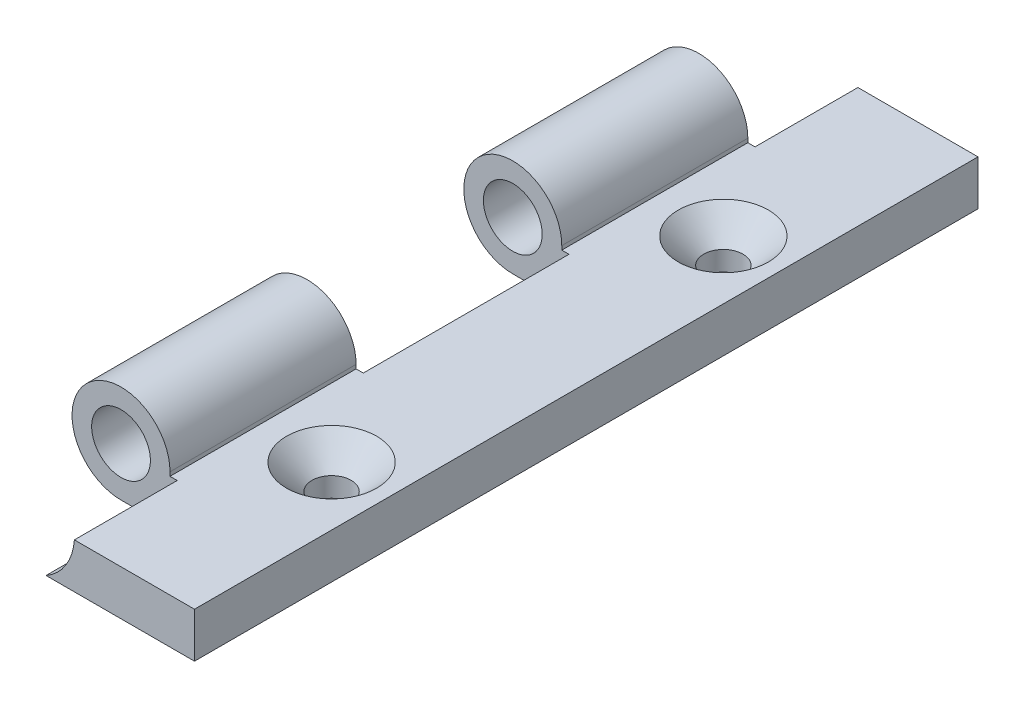
ISO-10303-21;
HEADER;
FILE_DESCRIPTION(('STEP AP214'),'2;1');
FILE_NAME('part.step','',(''),(''),'','','');
FILE_SCHEMA(('AUTOMOTIVE_DESIGN { 1 0 10303 214 1 1 1 1 }'));
ENDSEC;
DATA;
#1=APPLICATION_CONTEXT('core data for automotive mechanical design processes');
#2=APPLICATION_PROTOCOL_DEFINITION('international standard','automotive_design',2000,#1);
#3=PRODUCT_CONTEXT('',#1,'mechanical');
#4=PRODUCT('Part','Part','',(#3));
#5=PRODUCT_RELATED_PRODUCT_CATEGORY('part','',(#4));
#6=PRODUCT_DEFINITION_FORMATION('','',#4);
#7=PRODUCT_DEFINITION_CONTEXT('part definition',#1,'design');
#8=PRODUCT_DEFINITION('design','',#6,#7);
#9=PRODUCT_DEFINITION_SHAPE('','',#8);
#10=(LENGTH_UNIT() NAMED_UNIT(*) SI_UNIT(.MILLI.,.METRE.));
#11=(NAMED_UNIT(*) PLANE_ANGLE_UNIT() SI_UNIT($,.RADIAN.));
#12=(NAMED_UNIT(*) SI_UNIT($,.STERADIAN.) SOLID_ANGLE_UNIT());
#13=UNCERTAINTY_MEASURE_WITH_UNIT(LENGTH_MEASURE(1.E-05),#10,'distance_accuracy_value','');
#14=(GEOMETRIC_REPRESENTATION_CONTEXT(3) GLOBAL_UNCERTAINTY_ASSIGNED_CONTEXT((#13)) GLOBAL_UNIT_ASSIGNED_CONTEXT((#10,
#11,#12)) REPRESENTATION_CONTEXT('',''));
#15=CARTESIAN_POINT('',(0.,0.,0.));
#16=DIRECTION('',(0.,0.,1.));
#17=DIRECTION('',(1.,0.,0.));
#18=AXIS2_PLACEMENT_3D('',#15,#16,#17);
#19=CARTESIAN_POINT('',(-9.,2.5,-40.));
#20=DIRECTION('',(0.,0.,1.));
#21=DIRECTION('',(1.,0.,0.));
#22=AXIS2_PLACEMENT_3D('',#19,#20,#21);
#23=CYLINDRICAL_SURFACE('',#22,1.5);
#24=CARTESIAN_POINT('',(-9.,2.5,-25.25));
#25=DIRECTION('',(0.,0.,-1.));
#26=DIRECTION('',(-1.,0.,0.));
#27=AXIS2_PLACEMENT_3D('',#24,#25,#26);
#28=CIRCLE('',#27,1.5);
#29=CARTESIAN_POINT('',(-10.5,2.5,-25.25));
#30=VERTEX_POINT('',#29);
#31=EDGE_CURVE('E405',#30,#30,#28,.F.);
#32=ORIENTED_EDGE('',*,*,#31,.T.);
#33=EDGE_LOOP('',(#32));
#34=FACE_BOUND('',#33,.T.);
#35=CARTESIAN_POINT('',(-9.,2.5,-34.75));
#36=DIRECTION('',(0.,0.,-1.));
#37=DIRECTION('',(-1.,0.,0.));
#38=AXIS2_PLACEMENT_3D('',#35,#36,#37);
#39=CIRCLE('',#38,1.5);
#40=CARTESIAN_POINT('',(-10.5,2.5,-34.75));
#41=VERTEX_POINT('',#40);
#42=EDGE_CURVE('E176',#41,#41,#39,.F.);
#43=ORIENTED_EDGE('',*,*,#42,.F.);
#44=EDGE_LOOP('',(#43));
#45=FACE_BOUND('',#44,.T.);
#46=ADVANCED_FACE('F37',(#34,#45),#23,.F.);
#47=CARTESIAN_POINT('',(0.,0.,0.));
#48=DIRECTION('',(0.,1.,0.));
#49=DIRECTION('',(0.,0.,1.));
#50=AXIS2_PLACEMENT_3D('',#47,#48,#49);
#51=PLANE('',#50);
#52=CARTESIAN_POINT('',(-3.,0.,-30.));
#53=DIRECTION('',(0.,-1.,0.));
#54=DIRECTION('',(0.,0.,-1.));
#55=AXIS2_PLACEMENT_3D('',#52,#53,#54);
#56=CIRCLE('',#55,1.);
#57=CARTESIAN_POINT('',(-3.,0.,-31.));
#58=VERTEX_POINT('',#57);
#59=EDGE_CURVE('E387',#58,#58,#56,.T.);
#60=ORIENTED_EDGE('',*,*,#59,.F.);
#61=EDGE_LOOP('',(#60));
#62=FACE_BOUND('',#61,.T.);
#63=CARTESIAN_POINT('',(-3.,0.,-10.));
#64=DIRECTION('',(0.,1.,0.));
#65=DIRECTION('',(0.,0.,1.));
#66=AXIS2_PLACEMENT_3D('',#63,#64,#65);
#67=CIRCLE('',#66,1.);
#68=CARTESIAN_POINT('',(-3.,0.,-9.));
#69=VERTEX_POINT('',#68);
#70=EDGE_CURVE('E384',#69,#69,#67,.T.);
#71=ORIENTED_EDGE('',*,*,#70,.T.);
#72=EDGE_LOOP('',(#71));
#73=FACE_BOUND('',#72,.T.);
#74=DIRECTION('',(0.,0.,-1.));
#75=VECTOR('',#74,1.);
#76=CARTESIAN_POINT('',(-7.58027291354994,0.,-6.6182720163547));
#77=LINE('',#76,#75);
#78=CARTESIAN_POINT('',(-7.58027291354994,0.,-25.25));
#79=VERTEX_POINT('',#78);
#80=CARTESIAN_POINT('',(-7.58027291354994,0.,-14.75));
#81=VERTEX_POINT('',#80);
#82=EDGE_CURVE('E174',#79,#81,#77,.F.);
#83=ORIENTED_EDGE('',*,*,#82,.F.);
#84=DIRECTION('',(-1.,0.,0.));
#85=VECTOR('',#84,1.);
#86=CARTESIAN_POINT('',(0.,0.,-25.25));
#87=LINE('',#86,#85);
#88=CARTESIAN_POINT('',(-9.,0.,-25.25));
#89=VERTEX_POINT('',#88);
#90=EDGE_CURVE('E390',#79,#89,#87,.T.);
#91=ORIENTED_EDGE('',*,*,#90,.T.);
#92=DIRECTION('',(0.,0.,1.));
#93=VECTOR('',#92,1.);
#94=CARTESIAN_POINT('',(-9.,0.,0.));
#95=LINE('',#94,#93);
#96=CARTESIAN_POINT('',(-9.,0.,-34.75));
#97=VERTEX_POINT('',#96);
#98=EDGE_CURVE('E441',#97,#89,#95,.T.);
#99=ORIENTED_EDGE('',*,*,#98,.F.);
#100=DIRECTION('',(-1.,0.,0.));
#101=VECTOR('',#100,1.);
#102=CARTESIAN_POINT('',(0.,0.,-34.75));
#103=LINE('',#102,#101);
#104=CARTESIAN_POINT('',(-7.58027291354994,0.,-34.75));
#105=VERTEX_POINT('',#104);
#106=EDGE_CURVE('E400',#105,#97,#103,.T.);
#107=ORIENTED_EDGE('',*,*,#106,.F.);
#108=DIRECTION('',(0.,0.,-1.));
#109=VECTOR('',#108,1.);
#110=CARTESIAN_POINT('',(-7.58027291354994,0.,2.8817279836453));
#111=LINE('',#110,#109);
#112=CARTESIAN_POINT('',(-7.58027291354994,0.,-40.));
#113=VERTEX_POINT('',#112);
#114=EDGE_CURVE('E402',#113,#105,#111,.F.);
#115=ORIENTED_EDGE('',*,*,#114,.F.);
#116=DIRECTION('',(-1.,0.,0.));
#117=VECTOR('',#116,1.);
#118=CARTESIAN_POINT('',(0.,0.,-40.));
#119=LINE('',#118,#117);
#120=CARTESIAN_POINT('',(0.,0.,-40.));
#121=VERTEX_POINT('',#120);
#122=EDGE_CURVE('E438',#121,#113,#119,.T.);
#123=ORIENTED_EDGE('',*,*,#122,.F.);
#124=DIRECTION('',(0.,0.,-1.));
#125=VECTOR('',#124,1.);
#126=CARTESIAN_POINT('',(0.,0.,0.));
#127=LINE('',#126,#125);
#128=CARTESIAN_POINT('',(0.,0.,0.));
#129=VERTEX_POINT('',#128);
#130=EDGE_CURVE('E161',#129,#121,#127,.T.);
#131=ORIENTED_EDGE('',*,*,#130,.F.);
#132=DIRECTION('',(1.,0.,0.));
#133=VECTOR('',#132,1.);
#134=CARTESIAN_POINT('',(0.,0.,0.));
#135=LINE('',#134,#133);
#136=CARTESIAN_POINT('',(-7.58027291354994,0.,0.));
#137=VERTEX_POINT('',#136);
#138=EDGE_CURVE('E168',#137,#129,#135,.T.);
#139=ORIENTED_EDGE('',*,*,#138,.F.);
#140=DIRECTION('',(0.,0.,1.));
#141=VECTOR('',#140,1.);
#142=CARTESIAN_POINT('',(-7.58027291354994,0.,-13.3817279836453));
#143=LINE('',#142,#141);
#144=CARTESIAN_POINT('',(-7.58027291354994,0.,-5.25));
#145=VERTEX_POINT('',#144);
#146=EDGE_CURVE('E166',#137,#145,#143,.F.);
#147=ORIENTED_EDGE('',*,*,#146,.T.);
#148=DIRECTION('',(1.,0.,0.));
#149=VECTOR('',#148,1.);
#150=CARTESIAN_POINT('',(0.,0.,-5.25));
#151=LINE('',#150,#149);
#152=CARTESIAN_POINT('',(-9.,0.,-5.25));
#153=VERTEX_POINT('',#152);
#154=EDGE_CURVE('E424',#153,#145,#151,.T.);
#155=ORIENTED_EDGE('',*,*,#154,.F.);
#156=CARTESIAN_POINT('',(-9.,0.,-14.75));
#157=VERTEX_POINT('',#156);
#158=EDGE_CURVE('E440',#157,#153,#95,.T.);
#159=ORIENTED_EDGE('',*,*,#158,.F.);
#160=DIRECTION('',(1.,0.,0.));
#161=VECTOR('',#160,1.);
#162=CARTESIAN_POINT('',(0.,0.,-14.75));
#163=LINE('',#162,#161);
#164=EDGE_CURVE('E416',#157,#81,#163,.T.);
#165=ORIENTED_EDGE('',*,*,#164,.T.);
#166=EDGE_LOOP('',(#83,#91,#99,#107,#115,#123,#131,#139,#147,#155,#159,#165));
#167=FACE_BOUND('',#166,.T.);
#168=ADVANCED_FACE('F201',(#62,#73,#167),#51,.F.);
#169=CARTESIAN_POINT('',(-9.,2.5,-14.75));
#170=DIRECTION('',(0.,0.,1.));
#171=DIRECTION('',(1.,0.,0.));
#172=AXIS2_PLACEMENT_3D('',#169,#170,#171);
#173=CIRCLE('',#172,1.5);
#174=CARTESIAN_POINT('',(-7.5,2.5,-14.75));
#175=VERTEX_POINT('',#174);
#176=EDGE_CURVE('E222',#175,#175,#173,.T.);
#177=ORIENTED_EDGE('',*,*,#176,.F.);
#178=EDGE_LOOP('',(#177));
#179=FACE_BOUND('',#178,.T.);
#180=CARTESIAN_POINT('',(-9.,2.5,-5.25));
#181=DIRECTION('',(0.,0.,1.));
#182=DIRECTION('',(1.,0.,0.));
#183=AXIS2_PLACEMENT_3D('',#180,#181,#182);
#184=CIRCLE('',#183,1.5);
#185=CARTESIAN_POINT('',(-7.5,2.5,-5.25));
#186=VERTEX_POINT('',#185);
#187=EDGE_CURVE('E162',#186,#186,#184,.T.);
#188=ORIENTED_EDGE('',*,*,#187,.T.);
#189=EDGE_LOOP('',(#188));
#190=FACE_BOUND('',#189,.T.);
#191=ADVANCED_FACE('F204',(#179,#190),#23,.F.);
#192=CARTESIAN_POINT('',(0.,2.5,0.));
#193=DIRECTION('',(-1.,0.,0.));
#194=DIRECTION('',(0.,0.,1.));
#195=AXIS2_PLACEMENT_3D('',#192,#193,#194);
#196=PLANE('',#195);
#197=DIRECTION('',(0.,-1.,0.));
#198=VECTOR('',#197,1.);
#199=CARTESIAN_POINT('',(0.,2.5,-40.));
#200=LINE('',#199,#198);
#201=CARTESIAN_POINT('',(0.,2.3,-40.));
#202=VERTEX_POINT('',#201);
#203=EDGE_CURVE('E153',#202,#121,#200,.T.);
#204=ORIENTED_EDGE('',*,*,#203,.F.);
#205=DIRECTION('',(0.,0.,1.));
#206=VECTOR('',#205,1.);
#207=CARTESIAN_POINT('',(0.,2.3,-40.));
#208=LINE('',#207,#206);
#209=CARTESIAN_POINT('',(0.,2.3,0.));
#210=VERTEX_POINT('',#209);
#211=EDGE_CURVE('E139',#202,#210,#208,.T.);
#212=ORIENTED_EDGE('',*,*,#211,.T.);
#213=DIRECTION('',(0.,-1.,0.));
#214=VECTOR('',#213,1.);
#215=CARTESIAN_POINT('',(0.,2.5,0.));
#216=LINE('',#215,#214);
#217=EDGE_CURVE('E163',#210,#129,#216,.T.);
#218=ORIENTED_EDGE('',*,*,#217,.T.);
#219=ORIENTED_EDGE('',*,*,#130,.T.);
#220=EDGE_LOOP('',(#204,#212,#218,#219));
#221=FACE_BOUND('',#220,.T.);
#222=ADVANCED_FACE('F159',(#221),#196,.F.);
#223=CARTESIAN_POINT('',(0.,2.5,-40.));
#224=DIRECTION('',(0.,0.,1.));
#225=DIRECTION('',(1.,0.,0.));
#226=AXIS2_PLACEMENT_3D('',#223,#224,#225);
#227=PLANE('',#226);
#228=CARTESIAN_POINT('',(-9.,2.5,-40.));
#229=DIRECTION('',(0.,0.,1.));
#230=DIRECTION('',(1.,0.,0.));
#231=AXIS2_PLACEMENT_3D('',#228,#229,#230);
#232=CIRCLE('',#231,2.875);
#233=CARTESIAN_POINT('',(-6.13196495837307,2.3,-40.));
#234=VERTEX_POINT('',#233);
#235=EDGE_CURVE('E155',#234,#113,#232,.F.);
#236=ORIENTED_EDGE('',*,*,#235,.F.);
#237=DIRECTION('',(1.,0.,0.));
#238=VECTOR('',#237,1.);
#239=CARTESIAN_POINT('',(-6.5,2.3,-40.));
#240=LINE('',#239,#238);
#241=EDGE_CURVE('E54',#234,#202,#240,.T.);
#242=ORIENTED_EDGE('',*,*,#241,.T.);
#243=ORIENTED_EDGE('',*,*,#203,.T.);
#244=ORIENTED_EDGE('',*,*,#122,.T.);
#245=EDGE_LOOP('',(#236,#242,#243,#244));
#246=FACE_BOUND('',#245,.T.);
#247=ADVANCED_FACE('F151',(#246),#227,.F.);
#248=CARTESIAN_POINT('',(0.,2.5,0.));
#249=DIRECTION('',(0.,0.,-1.));
#250=DIRECTION('',(-1.,0.,0.));
#251=AXIS2_PLACEMENT_3D('',#248,#249,#250);
#252=PLANE('',#251);
#253=ORIENTED_EDGE('',*,*,#217,.F.);
#254=DIRECTION('',(1.,0.,0.));
#255=VECTOR('',#254,1.);
#256=CARTESIAN_POINT('',(-6.5,2.3,0.));
#257=LINE('',#256,#255);
#258=CARTESIAN_POINT('',(-6.13196495837307,2.3,0.));
#259=VERTEX_POINT('',#258);
#260=EDGE_CURVE('E143',#259,#210,#257,.T.);
#261=ORIENTED_EDGE('',*,*,#260,.F.);
#262=CARTESIAN_POINT('',(-9.,2.5,0.));
#263=DIRECTION('',(0.,0.,1.));
#264=DIRECTION('',(1.,0.,0.));
#265=AXIS2_PLACEMENT_3D('',#262,#263,#264);
#266=CIRCLE('',#265,2.875);
#267=EDGE_CURVE('E419',#137,#259,#266,.T.);
#268=ORIENTED_EDGE('',*,*,#267,.F.);
#269=ORIENTED_EDGE('',*,*,#138,.T.);
#270=EDGE_LOOP('',(#253,#261,#268,#269));
#271=FACE_BOUND('',#270,.T.);
#272=ADVANCED_FACE('F238',(#271),#252,.F.);
#273=CARTESIAN_POINT('',(-9.,2.5,-14.75));
#274=DIRECTION('',(0.,0.,1.));
#275=DIRECTION('',(1.,0.,0.));
#276=AXIS2_PLACEMENT_3D('',#273,#274,#275);
#277=PLANE('',#276);
#278=CARTESIAN_POINT('',(-9.,2.5,-14.75));
#279=DIRECTION('',(0.,0.,1.));
#280=DIRECTION('',(1.,0.,0.));
#281=AXIS2_PLACEMENT_3D('',#278,#279,#280);
#282=CIRCLE('',#281,2.5);
#283=CARTESIAN_POINT('',(-6.5,2.5,-14.75));
#284=VERTEX_POINT('',#283);
#285=EDGE_CURVE('E429',#284,#157,#282,.T.);
#286=ORIENTED_EDGE('',*,*,#285,.F.);
#287=DIRECTION('',(0.,-1.,0.));
#288=VECTOR('',#287,1.);
#289=CARTESIAN_POINT('',(-6.5,2.5,-14.75));
#290=LINE('',#289,#288);
#291=CARTESIAN_POINT('',(-6.5,2.3,-14.75));
#292=VERTEX_POINT('',#291);
#293=EDGE_CURVE('E393',#284,#292,#290,.T.);
#294=ORIENTED_EDGE('',*,*,#293,.T.);
#295=DIRECTION('',(1.,0.,0.));
#296=VECTOR('',#295,1.);
#297=CARTESIAN_POINT('',(-9.,2.3,-14.75));
#298=LINE('',#297,#296);
#299=CARTESIAN_POINT('',(-6.13196495837307,2.3,-14.75));
#300=VERTEX_POINT('',#299);
#301=EDGE_CURVE('E466',#292,#300,#298,.T.);
#302=ORIENTED_EDGE('',*,*,#301,.T.);
#303=CARTESIAN_POINT('',(-9.,2.5,-14.75));
#304=DIRECTION('',(0.,0.,1.));
#305=DIRECTION('',(1.,0.,0.));
#306=AXIS2_PLACEMENT_3D('',#303,#304,#305);
#307=CIRCLE('',#306,2.875);
#308=EDGE_CURVE('E62',#81,#300,#307,.T.);
#309=ORIENTED_EDGE('',*,*,#308,.F.);
#310=ORIENTED_EDGE('',*,*,#164,.F.);
#311=EDGE_LOOP('',(#286,#294,#302,#309,#310));
#312=FACE_BOUND('',#311,.T.);
#313=ORIENTED_EDGE('',*,*,#176,.T.);
#314=EDGE_LOOP('',(#313));
#315=FACE_BOUND('',#314,.T.);
#316=ADVANCED_FACE('F228',(#312,#315),#277,.F.);
#317=CARTESIAN_POINT('',(-9.,2.5,-5.25));
#318=DIRECTION('',(0.,0.,1.));
#319=DIRECTION('',(1.,0.,0.));
#320=AXIS2_PLACEMENT_3D('',#317,#318,#319);
#321=PLANE('',#320);
#322=DIRECTION('',(0.,-1.,0.));
#323=VECTOR('',#322,1.);
#324=CARTESIAN_POINT('',(-6.5,2.5,-5.25));
#325=LINE('',#324,#323);
#326=CARTESIAN_POINT('',(-6.5,2.5,-5.25));
#327=VERTEX_POINT('',#326);
#328=CARTESIAN_POINT('',(-6.5,2.3,-5.25));
#329=VERTEX_POINT('',#328);
#330=EDGE_CURVE('E478',#327,#329,#325,.T.);
#331=ORIENTED_EDGE('',*,*,#330,.F.);
#332=CARTESIAN_POINT('',(-9.,2.5,-5.25));
#333=DIRECTION('',(0.,0.,1.));
#334=DIRECTION('',(1.,0.,0.));
#335=AXIS2_PLACEMENT_3D('',#332,#333,#334);
#336=CIRCLE('',#335,2.5);
#337=EDGE_CURVE('E428',#327,#153,#336,.T.);
#338=ORIENTED_EDGE('',*,*,#337,.T.);
#339=ORIENTED_EDGE('',*,*,#154,.T.);
#340=CARTESIAN_POINT('',(-9.,2.5,-5.25));
#341=DIRECTION('',(0.,0.,1.));
#342=DIRECTION('',(1.,0.,0.));
#343=AXIS2_PLACEMENT_3D('',#340,#341,#342);
#344=CIRCLE('',#343,2.875);
#345=CARTESIAN_POINT('',(-6.13196495837307,2.3,-5.25));
#346=VERTEX_POINT('',#345);
#347=EDGE_CURVE('E422',#346,#145,#344,.F.);
#348=ORIENTED_EDGE('',*,*,#347,.F.);
#349=DIRECTION('',(1.,0.,0.));
#350=VECTOR('',#349,1.);
#351=CARTESIAN_POINT('',(-9.,2.3,-5.25));
#352=LINE('',#351,#350);
#353=EDGE_CURVE('E471',#329,#346,#352,.T.);
#354=ORIENTED_EDGE('',*,*,#353,.F.);
#355=EDGE_LOOP('',(#331,#338,#339,#348,#354));
#356=FACE_BOUND('',#355,.T.);
#357=ORIENTED_EDGE('',*,*,#187,.F.);
#358=EDGE_LOOP('',(#357));
#359=FACE_BOUND('',#358,.T.);
#360=ADVANCED_FACE('F225',(#356,#359),#321,.T.);
#361=CARTESIAN_POINT('',(-9.,2.5,-14.75));
#362=DIRECTION('',(0.,0.,1.));
#363=DIRECTION('',(1.,0.,0.));
#364=AXIS2_PLACEMENT_3D('',#361,#362,#363);
#365=CYLINDRICAL_SURFACE('',#364,2.5);
#366=ORIENTED_EDGE('',*,*,#337,.F.);
#367=DIRECTION('',(0.,0.,1.));
#368=VECTOR('',#367,1.);
#369=CARTESIAN_POINT('',(-6.5,2.5,-14.75));
#370=LINE('',#369,#368);
#371=EDGE_CURVE('E432',#327,#284,#370,.F.);
#372=ORIENTED_EDGE('',*,*,#371,.T.);
#373=ORIENTED_EDGE('',*,*,#285,.T.);
#374=ORIENTED_EDGE('',*,*,#158,.T.);
#375=EDGE_LOOP('',(#366,#372,#373,#374));
#376=FACE_BOUND('',#375,.T.);
#377=ADVANCED_FACE('F227',(#376),#365,.T.);
#378=CARTESIAN_POINT('',(-9.,2.5,-13.3817279836453));
#379=DIRECTION('',(0.,0.,1.));
#380=DIRECTION('',(1.,0.,0.));
#381=AXIS2_PLACEMENT_3D('',#378,#379,#380);
#382=CYLINDRICAL_SURFACE('',#381,2.875);
#383=ORIENTED_EDGE('',*,*,#267,.T.);
#384=DIRECTION('',(0.,0.,1.));
#385=VECTOR('',#384,1.);
#386=CARTESIAN_POINT('',(-6.13196495837307,2.3,-13.3817279836453));
#387=LINE('',#386,#385);
#388=EDGE_CURVE('E468',#259,#346,#387,.F.);
#389=ORIENTED_EDGE('',*,*,#388,.T.);
#390=ORIENTED_EDGE('',*,*,#347,.T.);
#391=ORIENTED_EDGE('',*,*,#146,.F.);
#392=EDGE_LOOP('',(#383,#389,#390,#391));
#393=FACE_BOUND('',#392,.T.);
#394=ADVANCED_FACE('F235',(#393),#382,.F.);
#395=CARTESIAN_POINT('',(-9.,2.5,-6.6182720163547));
#396=DIRECTION('',(0.,0.,-1.));
#397=DIRECTION('',(-1.,0.,0.));
#398=AXIS2_PLACEMENT_3D('',#395,#396,#397);
#399=CYLINDRICAL_SURFACE('',#398,2.875);
#400=DIRECTION('',(0.,0.,-1.));
#401=VECTOR('',#400,1.);
#402=CARTESIAN_POINT('',(-6.13196495837307,2.3,-6.6182720163547));
#403=LINE('',#402,#401);
#404=CARTESIAN_POINT('',(-6.13196495837307,2.3,-25.25));
#405=VERTEX_POINT('',#404);
#406=EDGE_CURVE('E464',#405,#300,#403,.F.);
#407=ORIENTED_EDGE('',*,*,#406,.F.);
#408=CARTESIAN_POINT('',(-9.,2.5,-25.25));
#409=DIRECTION('',(0.,0.,-1.));
#410=DIRECTION('',(-1.,0.,0.));
#411=AXIS2_PLACEMENT_3D('',#408,#409,#410);
#412=CIRCLE('',#411,2.875);
#413=EDGE_CURVE('E386',#79,#405,#412,.F.);
#414=ORIENTED_EDGE('',*,*,#413,.F.);
#415=ORIENTED_EDGE('',*,*,#82,.T.);
#416=ORIENTED_EDGE('',*,*,#308,.T.);
#417=EDGE_LOOP('',(#407,#414,#415,#416));
#418=FACE_BOUND('',#417,.T.);
#419=ADVANCED_FACE('F280',(#418),#399,.F.);
#420=CARTESIAN_POINT('',(-9.,2.5,-25.25));
#421=DIRECTION('',(0.,0.,-1.));
#422=DIRECTION('',(1.,0.,0.));
#423=AXIS2_PLACEMENT_3D('',#420,#421,#422);
#424=PLANE('',#423);
#425=ORIENTED_EDGE('',*,*,#31,.F.);
#426=EDGE_LOOP('',(#425));
#427=FACE_BOUND('',#426,.T.);
#428=DIRECTION('',(-1.,0.,0.));
#429=VECTOR('',#428,1.);
#430=CARTESIAN_POINT('',(-9.,2.3,-25.25));
#431=LINE('',#430,#429);
#432=CARTESIAN_POINT('',(-6.5,2.3,-25.25));
#433=VERTEX_POINT('',#432);
#434=EDGE_CURVE('E456',#405,#433,#431,.T.);
#435=ORIENTED_EDGE('',*,*,#434,.T.);
#436=DIRECTION('',(0.,1.,0.));
#437=VECTOR('',#436,1.);
#438=CARTESIAN_POINT('',(-6.5,2.5,-25.25));
#439=LINE('',#438,#437);
#440=CARTESIAN_POINT('',(-6.5,2.5,-25.25));
#441=VERTEX_POINT('',#440);
#442=EDGE_CURVE('E475',#433,#441,#439,.T.);
#443=ORIENTED_EDGE('',*,*,#442,.T.);
#444=CARTESIAN_POINT('',(-9.,2.5,-25.25));
#445=DIRECTION('',(0.,0.,1.));
#446=DIRECTION('',(1.,0.,0.));
#447=AXIS2_PLACEMENT_3D('',#444,#445,#446);
#448=CIRCLE('',#447,2.5);
#449=EDGE_CURVE('E408',#441,#89,#448,.T.);
#450=ORIENTED_EDGE('',*,*,#449,.T.);
#451=ORIENTED_EDGE('',*,*,#90,.F.);
#452=ORIENTED_EDGE('',*,*,#413,.T.);
#453=EDGE_LOOP('',(#435,#443,#450,#451,#452));
#454=FACE_BOUND('',#453,.T.);
#455=ADVANCED_FACE('F289',(#427,#454),#424,.F.);
#456=CARTESIAN_POINT('',(-9.,2.5,-34.75));
#457=DIRECTION('',(0.,0.,-1.));
#458=DIRECTION('',(1.,0.,0.));
#459=AXIS2_PLACEMENT_3D('',#456,#457,#458);
#460=PLANE('',#459);
#461=DIRECTION('',(0.,1.,0.));
#462=VECTOR('',#461,1.);
#463=CARTESIAN_POINT('',(-6.5,2.5,-34.75));
#464=LINE('',#463,#462);
#465=CARTESIAN_POINT('',(-6.5,2.3,-34.75));
#466=VERTEX_POINT('',#465);
#467=CARTESIAN_POINT('',(-6.5,2.5,-34.75));
#468=VERTEX_POINT('',#467);
#469=EDGE_CURVE('E473',#466,#468,#464,.T.);
#470=ORIENTED_EDGE('',*,*,#469,.F.);
#471=DIRECTION('',(-1.,0.,0.));
#472=VECTOR('',#471,1.);
#473=CARTESIAN_POINT('',(-9.,2.3,-34.75));
#474=LINE('',#473,#472);
#475=CARTESIAN_POINT('',(-6.13196495837307,2.3,-34.75));
#476=VERTEX_POINT('',#475);
#477=EDGE_CURVE('E453',#476,#466,#474,.T.);
#478=ORIENTED_EDGE('',*,*,#477,.F.);
#479=CARTESIAN_POINT('',(-9.,2.5,-34.75));
#480=DIRECTION('',(0.,0.,-1.));
#481=DIRECTION('',(-1.,0.,0.));
#482=AXIS2_PLACEMENT_3D('',#479,#480,#481);
#483=CIRCLE('',#482,2.875);
#484=EDGE_CURVE('E398',#476,#105,#483,.T.);
#485=ORIENTED_EDGE('',*,*,#484,.T.);
#486=ORIENTED_EDGE('',*,*,#106,.T.);
#487=CARTESIAN_POINT('',(-9.,2.5,-34.75));
#488=DIRECTION('',(0.,0.,1.));
#489=DIRECTION('',(1.,0.,0.));
#490=AXIS2_PLACEMENT_3D('',#487,#488,#489);
#491=CIRCLE('',#490,2.5);
#492=EDGE_CURVE('E407',#468,#97,#491,.T.);
#493=ORIENTED_EDGE('',*,*,#492,.F.);
#494=EDGE_LOOP('',(#470,#478,#485,#486,#493));
#495=FACE_BOUND('',#494,.T.);
#496=ORIENTED_EDGE('',*,*,#42,.T.);
#497=EDGE_LOOP('',(#496));
#498=FACE_BOUND('',#497,.T.);
#499=ADVANCED_FACE('F300',(#495,#498),#460,.T.);
#500=CARTESIAN_POINT('',(-9.,2.5,-25.25));
#501=DIRECTION('',(0.,0.,-1.));
#502=DIRECTION('',(-1.,0.,0.));
#503=AXIS2_PLACEMENT_3D('',#500,#501,#502);
#504=CYLINDRICAL_SURFACE('',#503,2.5);
#505=DIRECTION('',(0.,0.,-1.));
#506=VECTOR('',#505,1.);
#507=CARTESIAN_POINT('',(-6.5,2.5,-25.25));
#508=LINE('',#507,#506);
#509=EDGE_CURVE('E411',#468,#441,#508,.F.);
#510=ORIENTED_EDGE('',*,*,#509,.F.);
#511=ORIENTED_EDGE('',*,*,#492,.T.);
#512=ORIENTED_EDGE('',*,*,#98,.T.);
#513=ORIENTED_EDGE('',*,*,#449,.F.);
#514=EDGE_LOOP('',(#510,#511,#512,#513));
#515=FACE_BOUND('',#514,.T.);
#516=ADVANCED_FACE('F312',(#515),#504,.T.);
#517=CARTESIAN_POINT('',(-9.,2.5,2.8817279836453));
#518=DIRECTION('',(0.,0.,-1.));
#519=DIRECTION('',(-1.,0.,0.));
#520=AXIS2_PLACEMENT_3D('',#517,#518,#519);
#521=CYLINDRICAL_SURFACE('',#520,2.875);
#522=DIRECTION('',(0.,0.,-1.));
#523=VECTOR('',#522,1.);
#524=CARTESIAN_POINT('',(-6.13196495837307,2.3,2.8817279836453));
#525=LINE('',#524,#523);
#526=EDGE_CURVE('E451',#234,#476,#525,.F.);
#527=ORIENTED_EDGE('',*,*,#526,.F.);
#528=ORIENTED_EDGE('',*,*,#235,.T.);
#529=ORIENTED_EDGE('',*,*,#114,.T.);
#530=ORIENTED_EDGE('',*,*,#484,.F.);
#531=EDGE_LOOP('',(#527,#528,#529,#530));
#532=FACE_BOUND('',#531,.T.);
#533=ADVANCED_FACE('F324',(#532),#521,.F.);
#534=CARTESIAN_POINT('',(-3.,0.,-10.));
#535=DIRECTION('',(0.,1.,0.));
#536=DIRECTION('',(0.,0.,1.));
#537=AXIS2_PLACEMENT_3D('',#534,#535,#536);
#538=CYLINDRICAL_SURFACE('',#537,1.);
#539=CARTESIAN_POINT('',(-3.,1.00000000000001,-10.));
#540=DIRECTION('',(0.,1.,0.));
#541=DIRECTION('',(0.,0.,1.));
#542=AXIS2_PLACEMENT_3D('',#539,#540,#541);
#543=CIRCLE('',#542,1.);
#544=CARTESIAN_POINT('',(-3.,1.00000000000001,-9.));
#545=VERTEX_POINT('',#544);
#546=EDGE_CURVE('E11',#545,#545,#543,.T.);
#547=ORIENTED_EDGE('',*,*,#546,.T.);
#548=EDGE_LOOP('',(#547));
#549=FACE_BOUND('',#548,.T.);
#550=ORIENTED_EDGE('',*,*,#70,.F.);
#551=EDGE_LOOP('',(#550));
#552=FACE_BOUND('',#551,.T.);
#553=ADVANCED_FACE('F195',(#549,#552),#538,.F.);
#554=CARTESIAN_POINT('',(-3.,0.,-30.));
#555=DIRECTION('',(0.,1.,0.));
#556=DIRECTION('',(0.,0.,1.));
#557=AXIS2_PLACEMENT_3D('',#554,#555,#556);
#558=CYLINDRICAL_SURFACE('',#557,1.);
#559=CARTESIAN_POINT('',(-3.,0.99999999999999,-30.));
#560=DIRECTION('',(0.,1.,0.));
#561=DIRECTION('',(0.,0.,1.));
#562=AXIS2_PLACEMENT_3D('',#559,#560,#561);
#563=CIRCLE('',#562,1.);
#564=CARTESIAN_POINT('',(-3.,0.99999999999999,-29.));
#565=VERTEX_POINT('',#564);
#566=EDGE_CURVE('E47',#565,#565,#563,.T.);
#567=ORIENTED_EDGE('',*,*,#566,.T.);
#568=EDGE_LOOP('',(#567));
#569=FACE_BOUND('',#568,.T.);
#570=ORIENTED_EDGE('',*,*,#59,.T.);
#571=EDGE_LOOP('',(#570));
#572=FACE_BOUND('',#571,.T.);
#573=ADVANCED_FACE('F183',(#569,#572),#558,.F.);
#574=CARTESIAN_POINT('',(-3.,2.5,-30.));
#575=DIRECTION('',(0.,1.,0.));
#576=DIRECTION('',(0.,0.,1.));
#577=AXIS2_PLACEMENT_3D('',#574,#575,#576);
#578=CONICAL_SURFACE('',#577,2.5,0.785398163397445);
#579=CARTESIAN_POINT('',(-3.,2.3,-30.));
#580=DIRECTION('',(0.,-1.,0.));
#581=DIRECTION('',(0.,0.,-1.));
#582=AXIS2_PLACEMENT_3D('',#579,#580,#581);
#583=CIRCLE('',#582,2.3);
#584=CARTESIAN_POINT('',(-3.,2.3,-32.3));
#585=VERTEX_POINT('',#584);
#586=EDGE_CURVE('E454',#585,#585,#583,.T.);
#587=ORIENTED_EDGE('',*,*,#586,.F.);
#588=EDGE_LOOP('',(#587));
#589=FACE_BOUND('',#588,.T.);
#590=ORIENTED_EDGE('',*,*,#566,.F.);
#591=EDGE_LOOP('',(#590));
#592=FACE_BOUND('',#591,.T.);
#593=ADVANCED_FACE('F186',(#589,#592),#578,.F.);
#594=CARTESIAN_POINT('',(-3.,1.00000000000001,-10.));
#595=DIRECTION('',(0.,1.,0.));
#596=DIRECTION('',(0.,0.,1.));
#597=AXIS2_PLACEMENT_3D('',#594,#595,#596);
#598=CONICAL_SURFACE('',#597,1.,0.785398163397451);
#599=CARTESIAN_POINT('',(-3.,2.3,-10.));
#600=DIRECTION('',(0.,-1.,0.));
#601=DIRECTION('',(0.,0.,-1.));
#602=AXIS2_PLACEMENT_3D('',#599,#600,#601);
#603=CIRCLE('',#602,2.3);
#604=CARTESIAN_POINT('',(-3.,2.3,-12.3));
#605=VERTEX_POINT('',#604);
#606=EDGE_CURVE('E42',#605,#605,#603,.T.);
#607=ORIENTED_EDGE('',*,*,#606,.F.);
#608=EDGE_LOOP('',(#607));
#609=FACE_BOUND('',#608,.T.);
#610=ORIENTED_EDGE('',*,*,#546,.F.);
#611=EDGE_LOOP('',(#610));
#612=FACE_BOUND('',#611,.T.);
#613=ADVANCED_FACE('F40',(#609,#612),#598,.F.);
#614=CARTESIAN_POINT('',(-6.5,2.5,-40.));
#615=DIRECTION('',(-1.,0.,0.));
#616=DIRECTION('',(0.,0.,1.));
#617=AXIS2_PLACEMENT_3D('',#614,#615,#616);
#618=PLANE('',#617);
#619=ORIENTED_EDGE('',*,*,#371,.F.);
#620=ORIENTED_EDGE('',*,*,#330,.T.);
#621=DIRECTION('',(0.,0.,1.));
#622=VECTOR('',#621,1.);
#623=CARTESIAN_POINT('',(-6.5,2.3,-40.));
#624=LINE('',#623,#622);
#625=EDGE_CURVE('E156',#292,#329,#624,.T.);
#626=ORIENTED_EDGE('',*,*,#625,.F.);
#627=ORIENTED_EDGE('',*,*,#293,.F.);
#628=EDGE_LOOP('',(#619,#620,#626,#627));
#629=FACE_BOUND('',#628,.T.);
#630=ADVANCED_FACE('F193',(#629),#618,.F.);
#631=EDGE_CURVE('E147',#466,#433,#624,.T.);
#632=ORIENTED_EDGE('',*,*,#631,.F.);
#633=ORIENTED_EDGE('',*,*,#469,.T.);
#634=ORIENTED_EDGE('',*,*,#509,.T.);
#635=ORIENTED_EDGE('',*,*,#442,.F.);
#636=EDGE_LOOP('',(#632,#633,#634,#635));
#637=FACE_BOUND('',#636,.T.);
#638=ADVANCED_FACE('F355',(#637),#618,.F.);
#639=CARTESIAN_POINT('',(-6.5,2.3,-40.));
#640=DIRECTION('',(0.,-1.,0.));
#641=DIRECTION('',(0.,0.,-1.));
#642=AXIS2_PLACEMENT_3D('',#639,#640,#641);
#643=PLANE('',#642);
#644=ORIENTED_EDGE('',*,*,#353,.T.);
#645=ORIENTED_EDGE('',*,*,#388,.F.);
#646=ORIENTED_EDGE('',*,*,#260,.T.);
#647=ORIENTED_EDGE('',*,*,#211,.F.);
#648=ORIENTED_EDGE('',*,*,#241,.F.);
#649=ORIENTED_EDGE('',*,*,#526,.T.);
#650=ORIENTED_EDGE('',*,*,#477,.T.);
#651=ORIENTED_EDGE('',*,*,#631,.T.);
#652=ORIENTED_EDGE('',*,*,#434,.F.);
#653=ORIENTED_EDGE('',*,*,#406,.T.);
#654=ORIENTED_EDGE('',*,*,#301,.F.);
#655=ORIENTED_EDGE('',*,*,#625,.T.);
#656=EDGE_LOOP('',(#644,#645,#646,#647,#648,#649,#650,#651,#652,#653,#654,#655));
#657=FACE_BOUND('',#656,.T.);
#658=ORIENTED_EDGE('',*,*,#586,.T.);
#659=EDGE_LOOP('',(#658));
#660=FACE_BOUND('',#659,.T.);
#661=ORIENTED_EDGE('',*,*,#606,.T.);
#662=EDGE_LOOP('',(#661));
#663=FACE_BOUND('',#662,.T.);
#664=ADVANCED_FACE('F140',(#657,#660,#663),#643,.F.);
#665=CLOSED_SHELL('',(#46,#168,#191,#222,#247,#272,#316,#360,#377,#394,#419,#455,#499,#516,#533,
#553,#573,#593,#613,#630,#638,#664));
#666=MANIFOLD_SOLID_BREP('B2',#665);
#667=ADVANCED_BREP_SHAPE_REPRESENTATION('',(#18,#666),#14);
#668=SHAPE_DEFINITION_REPRESENTATION(#9,#667);
ENDSEC;
END-ISO-10303-21;
